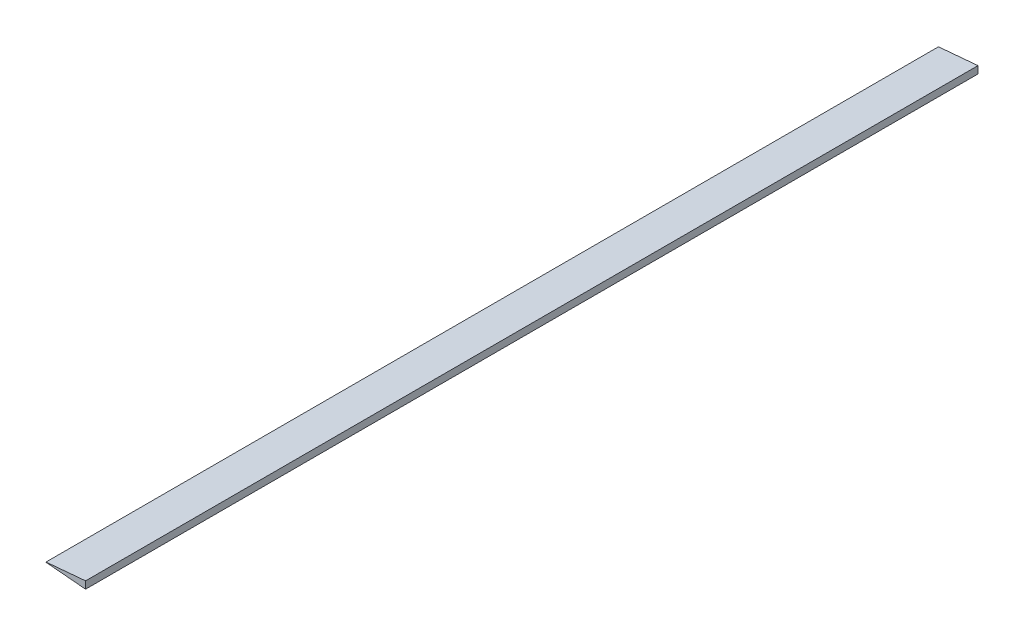
ISO-10303-21;
HEADER;
FILE_DESCRIPTION(('STEP AP214'),'2;1');
FILE_NAME('part.step','',(''),(''),'','','');
FILE_SCHEMA(('AUTOMOTIVE_DESIGN { 1 0 10303 214 1 1 1 1 }'));
ENDSEC;
DATA;
#1=APPLICATION_CONTEXT('core data for automotive mechanical design processes');
#2=APPLICATION_PROTOCOL_DEFINITION('international standard','automotive_design',2000,#1);
#3=PRODUCT_CONTEXT('',#1,'mechanical');
#4=PRODUCT('Part','Part','',(#3));
#5=PRODUCT_RELATED_PRODUCT_CATEGORY('part','',(#4));
#6=PRODUCT_DEFINITION_FORMATION('','',#4);
#7=PRODUCT_DEFINITION_CONTEXT('part definition',#1,'design');
#8=PRODUCT_DEFINITION('design','',#6,#7);
#9=PRODUCT_DEFINITION_SHAPE('','',#8);
#10=(LENGTH_UNIT() NAMED_UNIT(*) SI_UNIT(.MILLI.,.METRE.));
#11=(NAMED_UNIT(*) PLANE_ANGLE_UNIT() SI_UNIT($,.RADIAN.));
#12=(NAMED_UNIT(*) SI_UNIT($,.STERADIAN.) SOLID_ANGLE_UNIT());
#13=UNCERTAINTY_MEASURE_WITH_UNIT(LENGTH_MEASURE(1.E-05),#10,'distance_accuracy_value','');
#14=(GEOMETRIC_REPRESENTATION_CONTEXT(3) GLOBAL_UNCERTAINTY_ASSIGNED_CONTEXT((#13)) GLOBAL_UNIT_ASSIGNED_CONTEXT((#10,
#11,#12)) REPRESENTATION_CONTEXT('',''));
#15=CARTESIAN_POINT('',(0.,0.,0.));
#16=DIRECTION('',(0.,0.,1.));
#17=DIRECTION('',(1.,0.,0.));
#18=AXIS2_PLACEMENT_3D('',#15,#16,#17);
#19=CARTESIAN_POINT('',(-87.514,3.43444027663058,422.9));
#20=CARTESIAN_POINT('',(-87.6543707442235,3.42453564489197,422.9));
#21=CARTESIAN_POINT('',(-89.7387680342181,3.27745950257636,422.9));
#22=CARTESIAN_POINT('',(-93.6517149286766,2.97442958322029,422.9));
#23=CARTESIAN_POINT('',(-99.1192162555559,2.53792133932132,422.9));
#24=CARTESIAN_POINT('',(-104.185410687022,2.10931454685368,422.9));
#25=CARTESIAN_POINT('',(-108.795049028938,1.70187570932604,422.9));
#26=CARTESIAN_POINT('',(-112.897560329354,1.32409046834397,422.9));
#27=CARTESIAN_POINT('',(-116.448011673335,0.985258042901294,422.9));
#28=CARTESIAN_POINT('',(-119.407505811611,0.693967654504735,422.9));
#29=CARTESIAN_POINT('',(-121.743630756426,0.458114731985303,422.9));
#30=CARTESIAN_POINT('',(-123.4308011464,0.284382731850572,422.9));
#31=CARTESIAN_POINT('',(-124.45055229169,0.178005142379708,422.9));
#32=CARTESIAN_POINT('',(-124.905855356546,0.130142965179148,422.9));
#33=CARTESIAN_POINT('',(-125.02,0.118143899999998,422.9));
#34=B_SPLINE_CURVE_WITH_KNOTS('',3,(#19,#20,#21,#22,#23,#24,#25,#26,#27,#28,#29,#30,#31,#32,
#33),.UNSPECIFIED.,.F.,.F.,(4,1,1,1,1,1,1,1,1,1,1,1,4),(0.,0.0112115722778318,0.16648320133775,
0.312686160175411,0.448210552609216,0.571562715657405,0.681381362004341,0.776452466822885,
0.855722863352053,0.918312437422216,0.963524724344559,0.990855635167136,1.),.UNSPECIFIED.);
#35=DIRECTION('',(0.,0.,-1.));
#36=VECTOR('',#35,1.);
#37=SURFACE_OF_LINEAR_EXTRUSION('',#34,#36);
#38=CARTESIAN_POINT('',(-87.514,3.43444027663058,-422.9));
#39=CARTESIAN_POINT('',(-87.6543707442235,3.42453564489197,-422.9));
#40=CARTESIAN_POINT('',(-89.7387680342181,3.27745950257636,-422.9));
#41=CARTESIAN_POINT('',(-93.6517149286766,2.97442958322029,-422.9));
#42=CARTESIAN_POINT('',(-99.1192162555559,2.53792133932132,-422.9));
#43=CARTESIAN_POINT('',(-104.185410687022,2.10931454685368,-422.9));
#44=CARTESIAN_POINT('',(-108.795049028938,1.70187570932604,-422.9));
#45=CARTESIAN_POINT('',(-112.897560329354,1.32409046834397,-422.9));
#46=CARTESIAN_POINT('',(-116.448011673335,0.985258042901294,-422.9));
#47=CARTESIAN_POINT('',(-119.407505811611,0.693967654504735,-422.9));
#48=CARTESIAN_POINT('',(-121.743630756426,0.458114731985303,-422.9));
#49=CARTESIAN_POINT('',(-123.4308011464,0.284382731850572,-422.9));
#50=CARTESIAN_POINT('',(-124.45055229169,0.178005142379708,-422.9));
#51=CARTESIAN_POINT('',(-124.905855356546,0.130142965179148,-422.9));
#52=CARTESIAN_POINT('',(-125.02,0.118143899999998,-422.9));
#53=B_SPLINE_CURVE_WITH_KNOTS('',3,(#38,#39,#40,#41,#42,#43,#44,#45,#46,#47,#48,#49,#50,#51,
#52),.UNSPECIFIED.,.F.,.F.,(4,1,1,1,1,1,1,1,1,1,1,1,4),(0.,0.0112115722778318,0.16648320133775,
0.312686160175411,0.448210552609216,0.571562715657405,0.681381362004341,0.776452466822885,
0.855722863352053,0.918312437422216,0.963524724344559,0.990855635167136,1.),.UNSPECIFIED.);
#54=CARTESIAN_POINT('',(-87.514,3.43444027663058,-422.9));
#55=VERTEX_POINT('',#54);
#56=CARTESIAN_POINT('',(-125.02,0.118143899999998,-422.9));
#57=VERTEX_POINT('',#56);
#58=EDGE_CURVE('E122',#55,#57,#53,.T.);
#59=ORIENTED_EDGE('',*,*,#58,.T.);
#60=DIRECTION('',(0.,0.,-1.));
#61=VECTOR('',#60,1.);
#62=CARTESIAN_POINT('',(-125.02,0.118143899999998,422.9));
#63=LINE('',#62,#61);
#64=CARTESIAN_POINT('',(-125.02,0.118143899999998,422.9));
#65=VERTEX_POINT('',#64);
#66=EDGE_CURVE('E11',#65,#57,#63,.T.);
#67=ORIENTED_EDGE('',*,*,#66,.F.);
#68=CARTESIAN_POINT('',(-87.514,3.43444027663058,422.9));
#69=VERTEX_POINT('',#68);
#70=EDGE_CURVE('E91',#69,#65,#34,.T.);
#71=ORIENTED_EDGE('',*,*,#70,.F.);
#72=DIRECTION('',(0.,0.,-1.));
#73=VECTOR('',#72,1.);
#74=CARTESIAN_POINT('',(-87.514,3.43444027663058,422.9));
#75=LINE('',#74,#73);
#76=EDGE_CURVE('E99',#69,#55,#75,.T.);
#77=ORIENTED_EDGE('',*,*,#76,.T.);
#78=EDGE_LOOP('',(#59,#67,#71,#77));
#79=FACE_BOUND('',#78,.T.);
#80=ADVANCED_FACE('F39',(#79),#37,.F.);
#81=CARTESIAN_POINT('',(-125.02,0.118143899999998,422.9));
#82=DIRECTION('',(1.,0.,0.));
#83=DIRECTION('',(0.,0.,-1.));
#84=AXIS2_PLACEMENT_3D('',#81,#82,#83);
#85=PLANE('',#84);
#86=DIRECTION('',(0.,-1.,0.));
#87=VECTOR('',#86,1.);
#88=CARTESIAN_POINT('',(-125.02,0.118143899999998,-422.9));
#89=LINE('',#88,#87);
#90=CARTESIAN_POINT('',(-125.02,-0.118143899999998,-422.9));
#91=VERTEX_POINT('',#90);
#92=EDGE_CURVE('E95',#57,#91,#89,.T.);
#93=ORIENTED_EDGE('',*,*,#92,.T.);
#94=DIRECTION('',(0.,0.,-1.));
#95=VECTOR('',#94,1.);
#96=CARTESIAN_POINT('',(-125.02,-0.118143899999998,422.9));
#97=LINE('',#96,#95);
#98=CARTESIAN_POINT('',(-125.02,-0.118143899999998,422.9));
#99=VERTEX_POINT('',#98);
#100=EDGE_CURVE('E48',#99,#91,#97,.T.);
#101=ORIENTED_EDGE('',*,*,#100,.F.);
#102=DIRECTION('',(0.,-1.,0.));
#103=VECTOR('',#102,1.);
#104=CARTESIAN_POINT('',(-125.02,0.118143899999998,422.9));
#105=LINE('',#104,#103);
#106=EDGE_CURVE('E86',#65,#99,#105,.T.);
#107=ORIENTED_EDGE('',*,*,#106,.F.);
#108=ORIENTED_EDGE('',*,*,#66,.T.);
#109=EDGE_LOOP('',(#93,#101,#107,#108));
#110=FACE_BOUND('',#109,.T.);
#111=ADVANCED_FACE('F94',(#110),#85,.F.);
#112=CARTESIAN_POINT('',(-125.02,-0.118143899999998,422.9));
#113=CARTESIAN_POINT('',(-124.905855356546,-0.130142965179148,422.9));
#114=CARTESIAN_POINT('',(-124.45055229169,-0.178005142379708,422.9));
#115=CARTESIAN_POINT('',(-123.4308011464,-0.284382731850572,422.9));
#116=CARTESIAN_POINT('',(-121.743630756426,-0.458114731985303,422.9));
#117=CARTESIAN_POINT('',(-119.407505811611,-0.693967654504735,422.9));
#118=CARTESIAN_POINT('',(-116.448011673335,-0.985258042901294,422.9));
#119=CARTESIAN_POINT('',(-112.897560329354,-1.32409046834397,422.9));
#120=CARTESIAN_POINT('',(-108.795049028938,-1.70187570932604,422.9));
#121=CARTESIAN_POINT('',(-104.185410687022,-2.10931454685368,422.9));
#122=CARTESIAN_POINT('',(-99.1192162555559,-2.53792133932132,422.9));
#123=CARTESIAN_POINT('',(-93.6517149286766,-2.97442958322029,422.9));
#124=CARTESIAN_POINT('',(-89.7387680342181,-3.27745950257636,422.9));
#125=CARTESIAN_POINT('',(-87.6543707442235,-3.42453564489197,422.9));
#126=CARTESIAN_POINT('',(-87.514,-3.43444027663058,422.9));
#127=B_SPLINE_CURVE_WITH_KNOTS('',3,(#112,#113,#114,#115,#116,#117,#118,#119,#120,#121,#122,
#123,#124,#125,#126),.UNSPECIFIED.,.F.,.F.,(4,1,1,1,1,1,1,1,1,1,1,1,4),(0.,0.00914436483286374,
0.0364752756554414,0.081687562577784,0.144277136647947,0.223547533177115,0.318618637995659,
0.428437284342595,0.551789447390784,0.687313839824589,0.83351679866225,0.988788427722168,1.),.UNSPECIFIED.);
#128=DIRECTION('',(0.,0.,-1.));
#129=VECTOR('',#128,1.);
#130=SURFACE_OF_LINEAR_EXTRUSION('',#127,#129);
#131=CARTESIAN_POINT('',(-125.02,-0.118143899999998,-422.9));
#132=CARTESIAN_POINT('',(-124.905855356546,-0.130142965179148,-422.9));
#133=CARTESIAN_POINT('',(-124.45055229169,-0.178005142379708,-422.9));
#134=CARTESIAN_POINT('',(-123.4308011464,-0.284382731850572,-422.9));
#135=CARTESIAN_POINT('',(-121.743630756426,-0.458114731985303,-422.9));
#136=CARTESIAN_POINT('',(-119.407505811611,-0.693967654504735,-422.9));
#137=CARTESIAN_POINT('',(-116.448011673335,-0.985258042901294,-422.9));
#138=CARTESIAN_POINT('',(-112.897560329354,-1.32409046834397,-422.9));
#139=CARTESIAN_POINT('',(-108.795049028938,-1.70187570932604,-422.9));
#140=CARTESIAN_POINT('',(-104.185410687022,-2.10931454685368,-422.9));
#141=CARTESIAN_POINT('',(-99.1192162555559,-2.53792133932132,-422.9));
#142=CARTESIAN_POINT('',(-93.6517149286766,-2.97442958322029,-422.9));
#143=CARTESIAN_POINT('',(-89.7387680342181,-3.27745950257636,-422.9));
#144=CARTESIAN_POINT('',(-87.6543707442235,-3.42453564489197,-422.9));
#145=CARTESIAN_POINT('',(-87.514,-3.43444027663058,-422.9));
#146=B_SPLINE_CURVE_WITH_KNOTS('',3,(#131,#132,#133,#134,#135,#136,#137,#138,#139,#140,#141,
#142,#143,#144,#145),.UNSPECIFIED.,.F.,.F.,(4,1,1,1,1,1,1,1,1,1,1,1,4),(0.,0.00914436483286374,
0.0364752756554414,0.081687562577784,0.144277136647947,0.223547533177115,0.318618637995659,
0.428437284342595,0.551789447390784,0.687313839824589,0.83351679866225,0.988788427722168,1.),.UNSPECIFIED.);
#147=CARTESIAN_POINT('',(-87.514,-3.43444027663058,-422.9));
#148=VERTEX_POINT('',#147);
#149=EDGE_CURVE('E73',#91,#148,#146,.T.);
#150=ORIENTED_EDGE('',*,*,#149,.T.);
#151=DIRECTION('',(0.,0.,-1.));
#152=VECTOR('',#151,1.);
#153=CARTESIAN_POINT('',(-87.514,-3.43444027663058,422.9));
#154=LINE('',#153,#152);
#155=CARTESIAN_POINT('',(-87.514,-3.43444027663058,422.9));
#156=VERTEX_POINT('',#155);
#157=EDGE_CURVE('E96',#156,#148,#154,.T.);
#158=ORIENTED_EDGE('',*,*,#157,.F.);
#159=EDGE_CURVE('E89',#99,#156,#127,.T.);
#160=ORIENTED_EDGE('',*,*,#159,.F.);
#161=ORIENTED_EDGE('',*,*,#100,.T.);
#162=EDGE_LOOP('',(#150,#158,#160,#161));
#163=FACE_BOUND('',#162,.T.);
#164=ADVANCED_FACE('F97',(#163),#130,.F.);
#165=CARTESIAN_POINT('',(-87.514,3.43444027663058,422.9));
#166=DIRECTION('',(-1.,0.,0.));
#167=DIRECTION('',(0.,0.,1.));
#168=AXIS2_PLACEMENT_3D('',#165,#166,#167);
#169=PLANE('',#168);
#170=DIRECTION('',(0.,1.,0.));
#171=VECTOR('',#170,1.);
#172=CARTESIAN_POINT('',(-87.514,3.43444027663058,-422.9));
#173=LINE('',#172,#171);
#174=EDGE_CURVE('E79',#148,#55,#173,.T.);
#175=ORIENTED_EDGE('',*,*,#174,.T.);
#176=ORIENTED_EDGE('',*,*,#76,.F.);
#177=DIRECTION('',(0.,1.,0.));
#178=VECTOR('',#177,1.);
#179=CARTESIAN_POINT('',(-87.514,3.43444027663058,422.9));
#180=LINE('',#179,#178);
#181=EDGE_CURVE('E56',#156,#69,#180,.T.);
#182=ORIENTED_EDGE('',*,*,#181,.F.);
#183=ORIENTED_EDGE('',*,*,#157,.T.);
#184=EDGE_LOOP('',(#175,#176,#182,#183));
#185=FACE_BOUND('',#184,.T.);
#186=ADVANCED_FACE('F111',(#185),#169,.F.);
#187=CARTESIAN_POINT('',(-106.280031805566,1.92340741016242,422.9));
#188=DIRECTION('',(0.,0.,-1.));
#189=DIRECTION('',(-1.,0.,0.));
#190=AXIS2_PLACEMENT_3D('',#187,#188,#189);
#191=PLANE('',#190);
#192=ORIENTED_EDGE('',*,*,#70,.T.);
#193=ORIENTED_EDGE('',*,*,#106,.T.);
#194=ORIENTED_EDGE('',*,*,#159,.T.);
#195=ORIENTED_EDGE('',*,*,#181,.T.);
#196=EDGE_LOOP('',(#192,#193,#194,#195));
#197=FACE_BOUND('',#196,.T.);
#198=ADVANCED_FACE('F87',(#197),#191,.F.);
#199=CARTESIAN_POINT('',(-106.280031805566,1.92340741016242,-422.9));
#200=DIRECTION('',(0.,0.,-1.));
#201=DIRECTION('',(-1.,0.,0.));
#202=AXIS2_PLACEMENT_3D('',#199,#200,#201);
#203=PLANE('',#202);
#204=ORIENTED_EDGE('',*,*,#58,.F.);
#205=ORIENTED_EDGE('',*,*,#174,.F.);
#206=ORIENTED_EDGE('',*,*,#149,.F.);
#207=ORIENTED_EDGE('',*,*,#92,.F.);
#208=EDGE_LOOP('',(#204,#205,#206,#207));
#209=FACE_BOUND('',#208,.T.);
#210=ADVANCED_FACE('F139',(#209),#203,.T.);
#211=CLOSED_SHELL('',(#80,#111,#164,#186,#198,#210));
#212=MANIFOLD_SOLID_BREP('B2',#211);
#213=ADVANCED_BREP_SHAPE_REPRESENTATION('',(#18,#212),#14);
#214=SHAPE_DEFINITION_REPRESENTATION(#9,#213);
ENDSEC;
END-ISO-10303-21;
